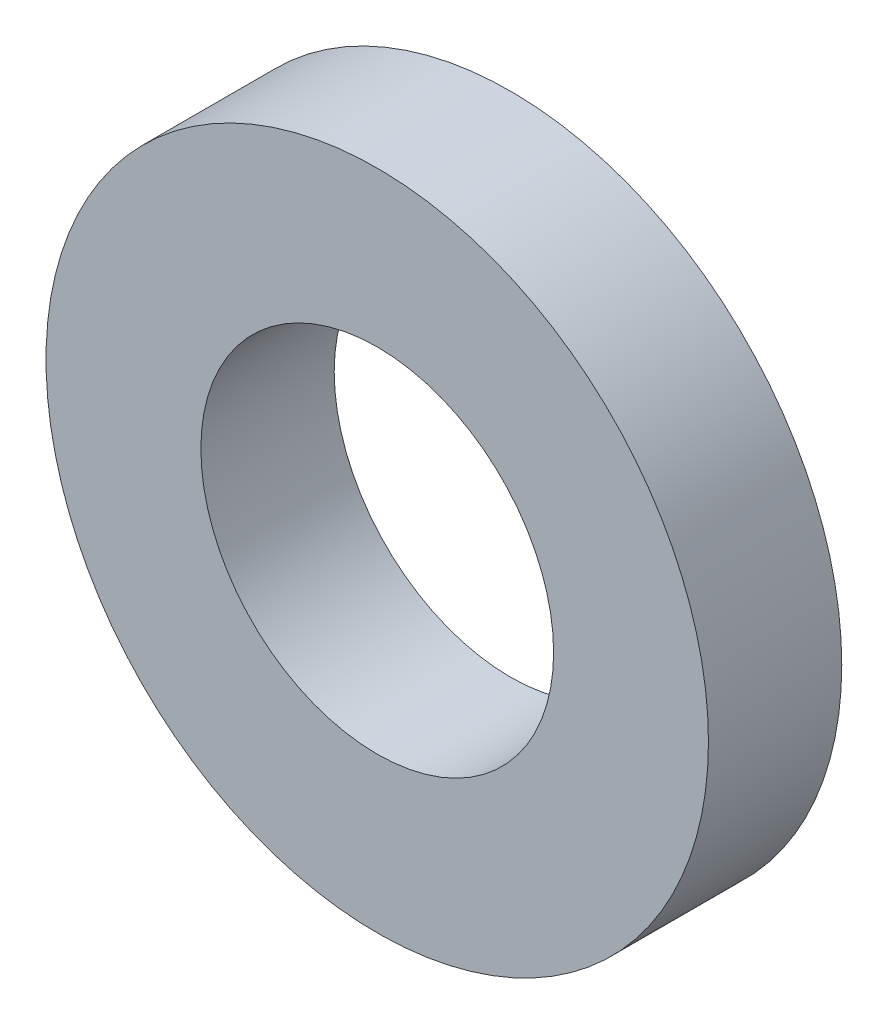
ISO-10303-21;
HEADER;
FILE_DESCRIPTION(('STEP AP214'),'2;1');
FILE_NAME('part.step','',(''),(''),'','','');
FILE_SCHEMA(('AUTOMOTIVE_DESIGN { 1 0 10303 214 1 1 1 1 }'));
ENDSEC;
DATA;
#1=APPLICATION_CONTEXT('core data for automotive mechanical design processes');
#2=APPLICATION_PROTOCOL_DEFINITION('international standard','automotive_design',2000,#1);
#3=PRODUCT_CONTEXT('',#1,'mechanical');
#4=PRODUCT('Part','Part','',(#3));
#5=PRODUCT_RELATED_PRODUCT_CATEGORY('part','',(#4));
#6=PRODUCT_DEFINITION_FORMATION('','',#4);
#7=PRODUCT_DEFINITION_CONTEXT('part definition',#1,'design');
#8=PRODUCT_DEFINITION('design','',#6,#7);
#9=PRODUCT_DEFINITION_SHAPE('','',#8);
#10=(LENGTH_UNIT() NAMED_UNIT(*) SI_UNIT(.MILLI.,.METRE.));
#11=(NAMED_UNIT(*) PLANE_ANGLE_UNIT() SI_UNIT($,.RADIAN.));
#12=(NAMED_UNIT(*) SI_UNIT($,.STERADIAN.) SOLID_ANGLE_UNIT());
#13=UNCERTAINTY_MEASURE_WITH_UNIT(LENGTH_MEASURE(1.E-05),#10,'distance_accuracy_value','');
#14=(GEOMETRIC_REPRESENTATION_CONTEXT(3) GLOBAL_UNCERTAINTY_ASSIGNED_CONTEXT((#13)) GLOBAL_UNIT_ASSIGNED_CONTEXT((#10,
#11,#12)) REPRESENTATION_CONTEXT('',''));
#15=CARTESIAN_POINT('',(0.,0.,0.));
#16=DIRECTION('',(0.,0.,1.));
#17=DIRECTION('',(1.,0.,0.));
#18=AXIS2_PLACEMENT_3D('',#15,#16,#17);
#19=CARTESIAN_POINT('',(0.,0.,4.8));
#20=DIRECTION('',(0.,0.,-1.));
#21=DIRECTION('',(-1.,0.,0.));
#22=AXIS2_PLACEMENT_3D('',#19,#20,#21);
#23=CYLINDRICAL_SURFACE('',#22,11.925);
#24=CARTESIAN_POINT('',(0.,0.,4.8));
#25=DIRECTION('',(0.,0.,1.));
#26=DIRECTION('',(1.,0.,0.));
#27=AXIS2_PLACEMENT_3D('',#24,#25,#26);
#28=CIRCLE('',#27,11.925);
#29=CARTESIAN_POINT('',(11.925,0.,4.8));
#30=VERTEX_POINT('',#29);
#31=EDGE_CURVE('E10',#30,#30,#28,.T.);
#32=ORIENTED_EDGE('',*,*,#31,.F.);
#33=EDGE_LOOP('',(#32));
#34=FACE_BOUND('',#33,.T.);
#35=CARTESIAN_POINT('',(0.,0.,0.));
#36=DIRECTION('',(0.,0.,1.));
#37=DIRECTION('',(1.,0.,0.));
#38=AXIS2_PLACEMENT_3D('',#35,#36,#37);
#39=CIRCLE('',#38,11.925);
#40=CARTESIAN_POINT('',(11.925,0.,0.));
#41=VERTEX_POINT('',#40);
#42=EDGE_CURVE('E34',#41,#41,#39,.T.);
#43=ORIENTED_EDGE('',*,*,#42,.T.);
#44=EDGE_LOOP('',(#43));
#45=FACE_BOUND('',#44,.T.);
#46=ADVANCED_FACE('F31',(#34,#45),#23,.T.);
#47=CARTESIAN_POINT('',(0.,0.,4.8));
#48=DIRECTION('',(0.,0.,1.));
#49=DIRECTION('',(1.,0.,0.));
#50=AXIS2_PLACEMENT_3D('',#47,#48,#49);
#51=PLANE('',#50);
#52=CARTESIAN_POINT('',(0.,0.,4.8));
#53=DIRECTION('',(0.,0.,1.));
#54=DIRECTION('',(1.,0.,0.));
#55=AXIS2_PLACEMENT_3D('',#52,#53,#54);
#56=CIRCLE('',#55,6.34999999999999);
#57=CARTESIAN_POINT('',(6.34999999999999,0.,4.8));
#58=VERTEX_POINT('',#57);
#59=EDGE_CURVE('E45',#58,#58,#56,.T.);
#60=ORIENTED_EDGE('',*,*,#59,.F.);
#61=EDGE_LOOP('',(#60));
#62=FACE_BOUND('',#61,.T.);
#63=ORIENTED_EDGE('',*,*,#31,.T.);
#64=EDGE_LOOP('',(#63));
#65=FACE_BOUND('',#64,.T.);
#66=ADVANCED_FACE('F51',(#62,#65),#51,.T.);
#67=CARTESIAN_POINT('',(0.,0.,0.));
#68=DIRECTION('',(0.,0.,1.));
#69=DIRECTION('',(1.,0.,0.));
#70=AXIS2_PLACEMENT_3D('',#67,#68,#69);
#71=PLANE('',#70);
#72=CARTESIAN_POINT('',(0.,0.,0.));
#73=DIRECTION('',(0.,0.,1.));
#74=DIRECTION('',(1.,0.,0.));
#75=AXIS2_PLACEMENT_3D('',#72,#73,#74);
#76=CIRCLE('',#75,6.35);
#77=CARTESIAN_POINT('',(6.35,0.,0.));
#78=VERTEX_POINT('',#77);
#79=EDGE_CURVE('E41',#78,#78,#76,.T.);
#80=ORIENTED_EDGE('',*,*,#79,.T.);
#81=EDGE_LOOP('',(#80));
#82=FACE_BOUND('',#81,.T.);
#83=ORIENTED_EDGE('',*,*,#42,.F.);
#84=EDGE_LOOP('',(#83));
#85=FACE_BOUND('',#84,.T.);
#86=ADVANCED_FACE('F53',(#82,#85),#71,.F.);
#87=CARTESIAN_POINT('',(0.,0.,4.8));
#88=DIRECTION('',(0.,0.,1.));
#89=DIRECTION('',(1.,0.,0.));
#90=AXIS2_PLACEMENT_3D('',#87,#88,#89);
#91=CYLINDRICAL_SURFACE('',#90,6.34999999999999);
#92=ORIENTED_EDGE('',*,*,#79,.F.);
#93=EDGE_LOOP('',(#92));
#94=FACE_BOUND('',#93,.T.);
#95=ORIENTED_EDGE('',*,*,#59,.T.);
#96=EDGE_LOOP('',(#95));
#97=FACE_BOUND('',#96,.T.);
#98=ADVANCED_FACE('F49',(#94,#97),#91,.F.);
#99=CLOSED_SHELL('',(#46,#66,#86,#98));
#100=MANIFOLD_SOLID_BREP('B2',#99);
#101=ADVANCED_BREP_SHAPE_REPRESENTATION('',(#18,#100),#14);
#102=SHAPE_DEFINITION_REPRESENTATION(#9,#101);
ENDSEC;
END-ISO-10303-21;
